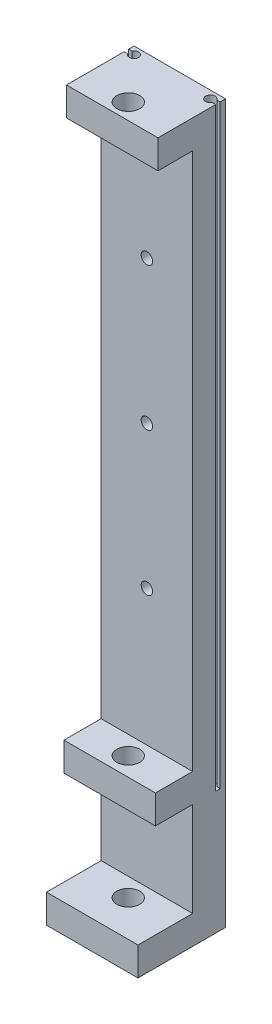
ISO-10303-21;
HEADER;
FILE_DESCRIPTION(('STEP AP214'),'2;1');
FILE_NAME('part.step','',(''),(''),'','','');
FILE_SCHEMA(('AUTOMOTIVE_DESIGN { 1 0 10303 214 1 1 1 1 }'));
ENDSEC;
DATA;
#1=APPLICATION_CONTEXT('core data for automotive mechanical design processes');
#2=APPLICATION_PROTOCOL_DEFINITION('international standard','automotive_design',2000,#1);
#3=PRODUCT_CONTEXT('',#1,'mechanical');
#4=PRODUCT('Part','Part','',(#3));
#5=PRODUCT_RELATED_PRODUCT_CATEGORY('part','',(#4));
#6=PRODUCT_DEFINITION_FORMATION('','',#4);
#7=PRODUCT_DEFINITION_CONTEXT('part definition',#1,'design');
#8=PRODUCT_DEFINITION('design','',#6,#7);
#9=PRODUCT_DEFINITION_SHAPE('','',#8);
#10=(LENGTH_UNIT() NAMED_UNIT(*) SI_UNIT(.MILLI.,.METRE.));
#11=(NAMED_UNIT(*) PLANE_ANGLE_UNIT() SI_UNIT($,.RADIAN.));
#12=(NAMED_UNIT(*) SI_UNIT($,.STERADIAN.) SOLID_ANGLE_UNIT());
#13=UNCERTAINTY_MEASURE_WITH_UNIT(LENGTH_MEASURE(1.E-05),#10,'distance_accuracy_value','');
#14=(GEOMETRIC_REPRESENTATION_CONTEXT(3) GLOBAL_UNCERTAINTY_ASSIGNED_CONTEXT((#13)) GLOBAL_UNIT_ASSIGNED_CONTEXT((#10,
#11,#12)) REPRESENTATION_CONTEXT('',''));
#15=CARTESIAN_POINT('',(0.,0.,0.));
#16=DIRECTION('',(0.,0.,1.));
#17=DIRECTION('',(1.,0.,0.));
#18=AXIS2_PLACEMENT_3D('',#15,#16,#17);
#19=CARTESIAN_POINT('',(-16.,275.003676271839,-3.8));
#20=DIRECTION('',(0.,0.,-1.));
#21=DIRECTION('',(-1.,0.,0.));
#22=AXIS2_PLACEMENT_3D('',#19,#20,#21);
#23=PLANE('',#22);
#24=CARTESIAN_POINT('',(1.74574066942157E-13,100.5,-3.8));
#25=DIRECTION('',(0.,0.,-1.));
#26=DIRECTION('',(-1.,0.,0.));
#27=AXIS2_PLACEMENT_3D('',#24,#25,#26);
#28=CIRCLE('',#27,2.);
#29=CARTESIAN_POINT('',(-1.99999999999983,100.5,-3.8));
#30=VERTEX_POINT('',#29);
#31=EDGE_CURVE('E250',#30,#30,#28,.F.);
#32=ORIENTED_EDGE('',*,*,#31,.F.);
#33=EDGE_LOOP('',(#32));
#34=FACE_BOUND('',#33,.T.);
#35=CARTESIAN_POINT('',(3.49148133884313E-13,150.5,-3.8));
#36=DIRECTION('',(0.,0.,-1.));
#37=DIRECTION('',(-1.,0.,0.));
#38=AXIS2_PLACEMENT_3D('',#35,#36,#37);
#39=CIRCLE('',#38,2.);
#40=CARTESIAN_POINT('',(-1.99999999999965,150.5,-3.8));
#41=VERTEX_POINT('',#40);
#42=EDGE_CURVE('E257',#41,#41,#39,.F.);
#43=ORIENTED_EDGE('',*,*,#42,.F.);
#44=EDGE_LOOP('',(#43));
#45=FACE_BOUND('',#44,.T.);
#46=CARTESIAN_POINT('',(5.2372220082647E-13,200.5,-3.8));
#47=DIRECTION('',(0.,0.,-1.));
#48=DIRECTION('',(-1.,0.,0.));
#49=AXIS2_PLACEMENT_3D('',#46,#47,#48);
#50=CIRCLE('',#49,2.);
#51=CARTESIAN_POINT('',(-1.99999999999948,200.5,-3.8));
#52=VERTEX_POINT('',#51);
#53=EDGE_CURVE('E263',#52,#52,#50,.F.);
#54=ORIENTED_EDGE('',*,*,#53,.F.);
#55=EDGE_LOOP('',(#54));
#56=FACE_BOUND('',#55,.T.);
#57=DIRECTION('',(1.,0.,0.));
#58=VECTOR('',#57,1.);
#59=CARTESIAN_POINT('',(-16.,53.,-3.8));
#60=LINE('',#59,#58);
#61=CARTESIAN_POINT('',(-16.,53.,-3.8));
#62=VERTEX_POINT('',#61);
#63=CARTESIAN_POINT('',(16.,53.,-3.8));
#64=VERTEX_POINT('',#63);
#65=EDGE_CURVE('E299',#62,#64,#60,.T.);
#66=ORIENTED_EDGE('',*,*,#65,.T.);
#67=DIRECTION('',(0.,-1.,0.));
#68=VECTOR('',#67,1.);
#69=CARTESIAN_POINT('',(16.,275.003676271839,-3.8));
#70=LINE('',#69,#68);
#71=CARTESIAN_POINT('',(16.,241.,-3.8));
#72=VERTEX_POINT('',#71);
#73=EDGE_CURVE('E344',#72,#64,#70,.T.);
#74=ORIENTED_EDGE('',*,*,#73,.F.);
#75=DIRECTION('',(1.,0.,0.));
#76=VECTOR('',#75,1.);
#77=CARTESIAN_POINT('',(-16.,241.,-3.8));
#78=LINE('',#77,#76);
#79=CARTESIAN_POINT('',(-16.,241.,-3.8));
#80=VERTEX_POINT('',#79);
#81=EDGE_CURVE('E340',#80,#72,#78,.T.);
#82=ORIENTED_EDGE('',*,*,#81,.F.);
#83=DIRECTION('',(0.,-1.,0.));
#84=VECTOR('',#83,1.);
#85=CARTESIAN_POINT('',(-16.,275.003676271839,-3.8));
#86=LINE('',#85,#84);
#87=EDGE_CURVE('E339',#80,#62,#86,.T.);
#88=ORIENTED_EDGE('',*,*,#87,.T.);
#89=EDGE_LOOP('',(#66,#74,#82,#88));
#90=FACE_BOUND('',#89,.T.);
#91=ADVANCED_FACE('F45',(#34,#45,#56,#90),#23,.F.);
#92=CARTESIAN_POINT('',(0.,10.,0.));
#93=DIRECTION('',(0.,-1.,0.));
#94=DIRECTION('',(0.,0.,-1.));
#95=AXIS2_PLACEMENT_3D('',#92,#93,#94);
#96=PLANE('',#95);
#97=CARTESIAN_POINT('',(0.,10.,2.7));
#98=DIRECTION('',(0.,-1.,0.));
#99=DIRECTION('',(0.,0.,-1.));
#100=AXIS2_PLACEMENT_3D('',#97,#98,#99);
#101=CIRCLE('',#100,4.);
#102=CARTESIAN_POINT('',(0.,10.,-1.3));
#103=VERTEX_POINT('',#102);
#104=EDGE_CURVE('E281',#103,#103,#101,.T.);
#105=ORIENTED_EDGE('',*,*,#104,.T.);
#106=EDGE_LOOP('',(#105));
#107=FACE_BOUND('',#106,.T.);
#108=DIRECTION('',(1.,0.,0.));
#109=VECTOR('',#108,1.);
#110=CARTESIAN_POINT('',(-16.,10.,-3.8));
#111=LINE('',#110,#109);
#112=CARTESIAN_POINT('',(-16.,10.,-3.8));
#113=VERTEX_POINT('',#112);
#114=CARTESIAN_POINT('',(16.,10.,-3.8));
#115=VERTEX_POINT('',#114);
#116=EDGE_CURVE('E335',#113,#115,#111,.T.);
#117=ORIENTED_EDGE('',*,*,#116,.F.);
#118=DIRECTION('',(0.,0.,1.));
#119=VECTOR('',#118,1.);
#120=CARTESIAN_POINT('',(-16.,10.,15.3));
#121=LINE('',#120,#119);
#122=CARTESIAN_POINT('',(-16.,10.,15.3));
#123=VERTEX_POINT('',#122);
#124=EDGE_CURVE('E351',#113,#123,#121,.T.);
#125=ORIENTED_EDGE('',*,*,#124,.T.);
#126=DIRECTION('',(1.,0.,0.));
#127=VECTOR('',#126,1.);
#128=CARTESIAN_POINT('',(-16.,10.,15.3));
#129=LINE('',#128,#127);
#130=CARTESIAN_POINT('',(16.,10.,15.3));
#131=VERTEX_POINT('',#130);
#132=EDGE_CURVE('E354',#123,#131,#129,.T.);
#133=ORIENTED_EDGE('',*,*,#132,.T.);
#134=DIRECTION('',(0.,0.,-1.));
#135=VECTOR('',#134,1.);
#136=CARTESIAN_POINT('',(16.,10.,15.3));
#137=LINE('',#136,#135);
#138=EDGE_CURVE('E348',#131,#115,#137,.T.);
#139=ORIENTED_EDGE('',*,*,#138,.T.);
#140=EDGE_LOOP('',(#117,#125,#133,#139));
#141=FACE_BOUND('',#140,.T.);
#142=ADVANCED_FACE('F389',(#107,#141),#96,.F.);
#143=CARTESIAN_POINT('',(16.,10.,15.3));
#144=DIRECTION('',(-1.,0.,0.));
#145=DIRECTION('',(0.,0.,1.));
#146=AXIS2_PLACEMENT_3D('',#143,#144,#145);
#147=PLANE('',#146);
#148=DIRECTION('',(0.,0.,-1.));
#149=VECTOR('',#148,1.);
#150=CARTESIAN_POINT('',(16.,43.,-11.85));
#151=LINE('',#150,#149);
#152=CARTESIAN_POINT('',(16.,43.,-11.85));
#153=VERTEX_POINT('',#152);
#154=CARTESIAN_POINT('',(16.,43.,-13.45));
#155=VERTEX_POINT('',#154);
#156=EDGE_CURVE('E237',#153,#155,#151,.T.);
#157=ORIENTED_EDGE('',*,*,#156,.F.);
#158=DIRECTION('',(0.,1.,0.));
#159=VECTOR('',#158,1.);
#160=CARTESIAN_POINT('',(16.,37.5796679068529,-11.85));
#161=LINE('',#160,#159);
#162=CARTESIAN_POINT('',(16.,251.,-11.85));
#163=VERTEX_POINT('',#162);
#164=EDGE_CURVE('E227',#153,#163,#161,.T.);
#165=ORIENTED_EDGE('',*,*,#164,.T.);
#166=DIRECTION('',(0.,0.,1.));
#167=VECTOR('',#166,1.);
#168=CARTESIAN_POINT('',(16.,251.,-15.3));
#169=LINE('',#168,#167);
#170=CARTESIAN_POINT('',(16.,251.,8.30000000000001));
#171=VERTEX_POINT('',#170);
#172=EDGE_CURVE('E324',#163,#171,#169,.T.);
#173=ORIENTED_EDGE('',*,*,#172,.T.);
#174=DIRECTION('',(0.,1.,0.));
#175=VECTOR('',#174,1.);
#176=CARTESIAN_POINT('',(16.,241.,8.30000000000001));
#177=LINE('',#176,#175);
#178=CARTESIAN_POINT('',(16.,241.,8.30000000000001));
#179=VERTEX_POINT('',#178);
#180=EDGE_CURVE('E331',#179,#171,#177,.T.);
#181=ORIENTED_EDGE('',*,*,#180,.F.);
#182=DIRECTION('',(0.,0.,1.));
#183=VECTOR('',#182,1.);
#184=CARTESIAN_POINT('',(16.,241.,-15.3));
#185=LINE('',#184,#183);
#186=EDGE_CURVE('E313',#72,#179,#185,.T.);
#187=ORIENTED_EDGE('',*,*,#186,.F.);
#188=ORIENTED_EDGE('',*,*,#73,.T.);
#189=DIRECTION('',(0.,0.,1.));
#190=VECTOR('',#189,1.);
#191=CARTESIAN_POINT('',(16.,53.,9.2));
#192=LINE('',#191,#190);
#193=CARTESIAN_POINT('',(16.,53.,9.2));
#194=VERTEX_POINT('',#193);
#195=EDGE_CURVE('E301',#64,#194,#192,.T.);
#196=ORIENTED_EDGE('',*,*,#195,.T.);
#197=DIRECTION('',(0.,1.,0.));
#198=VECTOR('',#197,1.);
#199=CARTESIAN_POINT('',(16.,43.,9.2));
#200=LINE('',#199,#198);
#201=CARTESIAN_POINT('',(16.,43.,9.2));
#202=VERTEX_POINT('',#201);
#203=EDGE_CURVE('E306',#202,#194,#200,.T.);
#204=ORIENTED_EDGE('',*,*,#203,.F.);
#205=DIRECTION('',(0.,0.,1.));
#206=VECTOR('',#205,1.);
#207=CARTESIAN_POINT('',(16.,43.,9.2));
#208=LINE('',#207,#206);
#209=CARTESIAN_POINT('',(16.,43.,-3.8));
#210=VERTEX_POINT('',#209);
#211=EDGE_CURVE('E292',#210,#202,#208,.T.);
#212=ORIENTED_EDGE('',*,*,#211,.F.);
#213=EDGE_CURVE('E338',#210,#115,#70,.T.);
#214=ORIENTED_EDGE('',*,*,#213,.T.);
#215=ORIENTED_EDGE('',*,*,#138,.F.);
#216=DIRECTION('',(0.,-1.,0.));
#217=VECTOR('',#216,1.);
#218=CARTESIAN_POINT('',(16.,10.,15.3));
#219=LINE('',#218,#217);
#220=CARTESIAN_POINT('',(16.,0.,15.3));
#221=VERTEX_POINT('',#220);
#222=EDGE_CURVE('E356',#131,#221,#219,.T.);
#223=ORIENTED_EDGE('',*,*,#222,.T.);
#224=DIRECTION('',(0.,0.,-1.));
#225=VECTOR('',#224,1.);
#226=CARTESIAN_POINT('',(16.,0.,15.3));
#227=LINE('',#226,#225);
#228=CARTESIAN_POINT('',(16.,0.,-15.3));
#229=VERTEX_POINT('',#228);
#230=EDGE_CURVE('E343',#221,#229,#227,.T.);
#231=ORIENTED_EDGE('',*,*,#230,.T.);
#232=DIRECTION('',(0.,-1.,0.));
#233=VECTOR('',#232,1.);
#234=CARTESIAN_POINT('',(16.,10.,-15.3));
#235=LINE('',#234,#233);
#236=CARTESIAN_POINT('',(16.,251.,-15.3));
#237=VERTEX_POINT('',#236);
#238=EDGE_CURVE('E11',#237,#229,#235,.T.);
#239=ORIENTED_EDGE('',*,*,#238,.F.);
#240=CARTESIAN_POINT('',(16.,251.,-13.45));
#241=VERTEX_POINT('',#240);
#242=EDGE_CURVE('E325',#237,#241,#169,.T.);
#243=ORIENTED_EDGE('',*,*,#242,.T.);
#244=DIRECTION('',(0.,1.,0.));
#245=VECTOR('',#244,1.);
#246=CARTESIAN_POINT('',(16.,37.5796679068529,-13.45));
#247=LINE('',#246,#245);
#248=EDGE_CURVE('E236',#155,#241,#247,.T.);
#249=ORIENTED_EDGE('',*,*,#248,.F.);
#250=EDGE_LOOP('',(#157,#165,#173,#181,#187,#188,#196,#204,#212,#214,#215,#223,#231,#239,#243,#249));
#251=FACE_BOUND('',#250,.T.);
#252=ADVANCED_FACE('F47',(#251),#147,.F.);
#253=CARTESIAN_POINT('',(-16.,10.,-15.3));
#254=DIRECTION('',(0.,0.,1.));
#255=DIRECTION('',(1.,0.,0.));
#256=AXIS2_PLACEMENT_3D('',#253,#254,#255);
#257=PLANE('',#256);
#258=CARTESIAN_POINT('',(0.,50.5,-15.3));
#259=DIRECTION('',(0.,0.,-1.));
#260=DIRECTION('',(-1.,0.,0.));
#261=AXIS2_PLACEMENT_3D('',#258,#259,#260);
#262=CIRCLE('',#261,2.);
#263=CARTESIAN_POINT('',(-2.,50.5,-15.3));
#264=VERTEX_POINT('',#263);
#265=EDGE_CURVE('E246',#264,#264,#262,.T.);
#266=ORIENTED_EDGE('',*,*,#265,.F.);
#267=EDGE_LOOP('',(#266));
#268=FACE_BOUND('',#267,.T.);
#269=CARTESIAN_POINT('',(1.74574066942157E-13,100.5,-15.3));
#270=DIRECTION('',(0.,0.,-1.));
#271=DIRECTION('',(-1.,0.,0.));
#272=AXIS2_PLACEMENT_3D('',#269,#270,#271);
#273=CIRCLE('',#272,2.);
#274=CARTESIAN_POINT('',(-1.99999999999983,100.5,-15.3));
#275=VERTEX_POINT('',#274);
#276=EDGE_CURVE('E254',#275,#275,#273,.T.);
#277=ORIENTED_EDGE('',*,*,#276,.F.);
#278=EDGE_LOOP('',(#277));
#279=FACE_BOUND('',#278,.T.);
#280=CARTESIAN_POINT('',(3.49148133884313E-13,150.5,-15.3));
#281=DIRECTION('',(0.,0.,-1.));
#282=DIRECTION('',(-1.,0.,0.));
#283=AXIS2_PLACEMENT_3D('',#280,#281,#282);
#284=CIRCLE('',#283,2.);
#285=CARTESIAN_POINT('',(-1.99999999999965,150.5,-15.3));
#286=VERTEX_POINT('',#285);
#287=EDGE_CURVE('E260',#286,#286,#284,.T.);
#288=ORIENTED_EDGE('',*,*,#287,.F.);
#289=EDGE_LOOP('',(#288));
#290=FACE_BOUND('',#289,.T.);
#291=CARTESIAN_POINT('',(5.2372220082647E-13,200.5,-15.3));
#292=DIRECTION('',(0.,0.,-1.));
#293=DIRECTION('',(-1.,0.,0.));
#294=AXIS2_PLACEMENT_3D('',#291,#292,#293);
#295=CIRCLE('',#294,2.);
#296=CARTESIAN_POINT('',(-1.99999999999948,200.5,-15.3));
#297=VERTEX_POINT('',#296);
#298=EDGE_CURVE('E217',#297,#297,#295,.T.);
#299=ORIENTED_EDGE('',*,*,#298,.F.);
#300=EDGE_LOOP('',(#299));
#301=FACE_BOUND('',#300,.T.);
#302=DIRECTION('',(-1.,0.,0.));
#303=VECTOR('',#302,1.);
#304=CARTESIAN_POINT('',(-16.,0.,-15.3));
#305=LINE('',#304,#303);
#306=CARTESIAN_POINT('',(-16.,0.,-15.3));
#307=VERTEX_POINT('',#306);
#308=EDGE_CURVE('E359',#229,#307,#305,.T.);
#309=ORIENTED_EDGE('',*,*,#308,.T.);
#310=DIRECTION('',(0.,-1.,0.));
#311=VECTOR('',#310,1.);
#312=CARTESIAN_POINT('',(-16.,10.,-15.3));
#313=LINE('',#312,#311);
#314=CARTESIAN_POINT('',(-16.,251.,-15.3));
#315=VERTEX_POINT('',#314);
#316=EDGE_CURVE('E54',#315,#307,#313,.T.);
#317=ORIENTED_EDGE('',*,*,#316,.F.);
#318=DIRECTION('',(1.,0.,0.));
#319=VECTOR('',#318,1.);
#320=CARTESIAN_POINT('',(-16.,251.,-15.3));
#321=LINE('',#320,#319);
#322=EDGE_CURVE('E321',#315,#237,#321,.T.);
#323=ORIENTED_EDGE('',*,*,#322,.T.);
#324=ORIENTED_EDGE('',*,*,#238,.T.);
#325=EDGE_LOOP('',(#309,#317,#323,#324));
#326=FACE_BOUND('',#325,.T.);
#327=ADVANCED_FACE('F432',(#268,#279,#290,#301,#326),#257,.F.);
#328=CARTESIAN_POINT('',(-16.,10.,15.3));
#329=DIRECTION('',(1.,0.,0.));
#330=DIRECTION('',(0.,0.,-1.));
#331=AXIS2_PLACEMENT_3D('',#328,#329,#330);
#332=PLANE('',#331);
#333=DIRECTION('',(0.,0.,1.));
#334=VECTOR('',#333,1.);
#335=CARTESIAN_POINT('',(-16.,43.,-11.85));
#336=LINE('',#335,#334);
#337=CARTESIAN_POINT('',(-16.,43.,-13.45));
#338=VERTEX_POINT('',#337);
#339=CARTESIAN_POINT('',(-16.,43.,-11.85));
#340=VERTEX_POINT('',#339);
#341=EDGE_CURVE('E194',#338,#340,#336,.T.);
#342=ORIENTED_EDGE('',*,*,#341,.F.);
#343=DIRECTION('',(0.,1.,0.));
#344=VECTOR('',#343,1.);
#345=CARTESIAN_POINT('',(-16.,37.5796679068529,-13.45));
#346=LINE('',#345,#344);
#347=CARTESIAN_POINT('',(-16.,251.,-13.45));
#348=VERTEX_POINT('',#347);
#349=EDGE_CURVE('E184',#338,#348,#346,.T.);
#350=ORIENTED_EDGE('',*,*,#349,.T.);
#351=DIRECTION('',(0.,0.,-1.));
#352=VECTOR('',#351,1.);
#353=CARTESIAN_POINT('',(-16.,251.,-15.3));
#354=LINE('',#353,#352);
#355=EDGE_CURVE('E309',#348,#315,#354,.T.);
#356=ORIENTED_EDGE('',*,*,#355,.T.);
#357=ORIENTED_EDGE('',*,*,#316,.T.);
#358=DIRECTION('',(0.,0.,1.));
#359=VECTOR('',#358,1.);
#360=CARTESIAN_POINT('',(-16.,0.,15.3));
#361=LINE('',#360,#359);
#362=CARTESIAN_POINT('',(-16.,0.,15.3));
#363=VERTEX_POINT('',#362);
#364=EDGE_CURVE('E361',#307,#363,#361,.T.);
#365=ORIENTED_EDGE('',*,*,#364,.T.);
#366=DIRECTION('',(0.,-1.,0.));
#367=VECTOR('',#366,1.);
#368=CARTESIAN_POINT('',(-16.,10.,15.3));
#369=LINE('',#368,#367);
#370=EDGE_CURVE('E366',#123,#363,#369,.T.);
#371=ORIENTED_EDGE('',*,*,#370,.F.);
#372=ORIENTED_EDGE('',*,*,#124,.F.);
#373=CARTESIAN_POINT('',(-16.,43.,-3.8));
#374=VERTEX_POINT('',#373);
#375=EDGE_CURVE('E334',#374,#113,#86,.T.);
#376=ORIENTED_EDGE('',*,*,#375,.F.);
#377=DIRECTION('',(0.,0.,-1.));
#378=VECTOR('',#377,1.);
#379=CARTESIAN_POINT('',(-16.,43.,9.2));
#380=LINE('',#379,#378);
#381=CARTESIAN_POINT('',(-16.,43.,9.2));
#382=VERTEX_POINT('',#381);
#383=EDGE_CURVE('E285',#382,#374,#380,.T.);
#384=ORIENTED_EDGE('',*,*,#383,.F.);
#385=DIRECTION('',(0.,1.,0.));
#386=VECTOR('',#385,1.);
#387=CARTESIAN_POINT('',(-16.,43.,9.2));
#388=LINE('',#387,#386);
#389=CARTESIAN_POINT('',(-16.,53.,9.2));
#390=VERTEX_POINT('',#389);
#391=EDGE_CURVE('E296',#382,#390,#388,.T.);
#392=ORIENTED_EDGE('',*,*,#391,.T.);
#393=DIRECTION('',(0.,0.,-1.));
#394=VECTOR('',#393,1.);
#395=CARTESIAN_POINT('',(-16.,53.,9.2));
#396=LINE('',#395,#394);
#397=EDGE_CURVE('E284',#390,#62,#396,.T.);
#398=ORIENTED_EDGE('',*,*,#397,.T.);
#399=ORIENTED_EDGE('',*,*,#87,.F.);
#400=DIRECTION('',(0.,0.,-1.));
#401=VECTOR('',#400,1.);
#402=CARTESIAN_POINT('',(-16.,241.,-15.3));
#403=LINE('',#402,#401);
#404=CARTESIAN_POINT('',(-16.,241.,8.3));
#405=VERTEX_POINT('',#404);
#406=EDGE_CURVE('E310',#405,#80,#403,.T.);
#407=ORIENTED_EDGE('',*,*,#406,.F.);
#408=DIRECTION('',(0.,1.,0.));
#409=VECTOR('',#408,1.);
#410=CARTESIAN_POINT('',(-16.,241.,8.3));
#411=LINE('',#410,#409);
#412=CARTESIAN_POINT('',(-16.,251.,8.3));
#413=VERTEX_POINT('',#412);
#414=EDGE_CURVE('E318',#405,#413,#411,.T.);
#415=ORIENTED_EDGE('',*,*,#414,.T.);
#416=CARTESIAN_POINT('',(-16.,251.,-11.85));
#417=VERTEX_POINT('',#416);
#418=EDGE_CURVE('E319',#413,#417,#354,.T.);
#419=ORIENTED_EDGE('',*,*,#418,.T.);
#420=DIRECTION('',(0.,1.,0.));
#421=VECTOR('',#420,1.);
#422=CARTESIAN_POINT('',(-16.,37.5796679068529,-11.85));
#423=LINE('',#422,#421);
#424=EDGE_CURVE('E206',#340,#417,#423,.T.);
#425=ORIENTED_EDGE('',*,*,#424,.F.);
#426=EDGE_LOOP('',(#342,#350,#356,#357,#365,#371,#372,#376,#384,#392,#398,#399,#407,#415,#419,#425));
#427=FACE_BOUND('',#426,.T.);
#428=ADVANCED_FACE('F204',(#427),#332,.F.);
#429=CARTESIAN_POINT('',(-16.,10.,15.3));
#430=DIRECTION('',(0.,0.,-1.));
#431=DIRECTION('',(-1.,0.,0.));
#432=AXIS2_PLACEMENT_3D('',#429,#430,#431);
#433=PLANE('',#432);
#434=DIRECTION('',(1.,0.,0.));
#435=VECTOR('',#434,1.);
#436=CARTESIAN_POINT('',(-16.,0.,15.3));
#437=LINE('',#436,#435);
#438=EDGE_CURVE('E352',#363,#221,#437,.T.);
#439=ORIENTED_EDGE('',*,*,#438,.T.);
#440=ORIENTED_EDGE('',*,*,#222,.F.);
#441=ORIENTED_EDGE('',*,*,#132,.F.);
#442=ORIENTED_EDGE('',*,*,#370,.T.);
#443=EDGE_LOOP('',(#439,#440,#441,#442));
#444=FACE_BOUND('',#443,.T.);
#445=ADVANCED_FACE('F381',(#444),#433,.F.);
#446=CARTESIAN_POINT('',(0.,0.,0.));
#447=DIRECTION('',(0.,-1.,0.));
#448=DIRECTION('',(0.,0.,-1.));
#449=AXIS2_PLACEMENT_3D('',#446,#447,#448);
#450=PLANE('',#449);
#451=CARTESIAN_POINT('',(0.,0.,2.7));
#452=DIRECTION('',(0.,-1.,0.));
#453=DIRECTION('',(0.,0.,-1.));
#454=AXIS2_PLACEMENT_3D('',#451,#452,#453);
#455=CIRCLE('',#454,4.);
#456=CARTESIAN_POINT('',(0.,0.,-1.3));
#457=VERTEX_POINT('',#456);
#458=EDGE_CURVE('E253',#457,#457,#455,.T.);
#459=ORIENTED_EDGE('',*,*,#458,.F.);
#460=EDGE_LOOP('',(#459));
#461=FACE_BOUND('',#460,.T.);
#462=ORIENTED_EDGE('',*,*,#230,.F.);
#463=ORIENTED_EDGE('',*,*,#438,.F.);
#464=ORIENTED_EDGE('',*,*,#364,.F.);
#465=ORIENTED_EDGE('',*,*,#308,.F.);
#466=EDGE_LOOP('',(#462,#463,#464,#465));
#467=FACE_BOUND('',#466,.T.);
#468=ADVANCED_FACE('F378',(#461,#467),#450,.T.);
#469=ORIENTED_EDGE('',*,*,#213,.F.);
#470=DIRECTION('',(1.,0.,0.));
#471=VECTOR('',#470,1.);
#472=CARTESIAN_POINT('',(-16.,43.,-3.8));
#473=LINE('',#472,#471);
#474=EDGE_CURVE('E288',#374,#210,#473,.T.);
#475=ORIENTED_EDGE('',*,*,#474,.F.);
#476=ORIENTED_EDGE('',*,*,#375,.T.);
#477=ORIENTED_EDGE('',*,*,#116,.T.);
#478=EDGE_LOOP('',(#469,#475,#476,#477));
#479=FACE_BOUND('',#478,.T.);
#480=ADVANCED_FACE('F392',(#479),#23,.F.);
#481=CARTESIAN_POINT('',(0.,241.,0.));
#482=DIRECTION('',(0.,1.,0.));
#483=DIRECTION('',(0.,0.,1.));
#484=AXIS2_PLACEMENT_3D('',#481,#482,#483);
#485=PLANE('',#484);
#486=CARTESIAN_POINT('',(0.,241.,2.7));
#487=DIRECTION('',(0.,1.,0.));
#488=DIRECTION('',(0.,0.,1.));
#489=AXIS2_PLACEMENT_3D('',#486,#487,#488);
#490=CIRCLE('',#489,4.);
#491=CARTESIAN_POINT('',(0.,241.,6.7));
#492=VERTEX_POINT('',#491);
#493=EDGE_CURVE('E278',#492,#492,#490,.T.);
#494=ORIENTED_EDGE('',*,*,#493,.T.);
#495=EDGE_LOOP('',(#494));
#496=FACE_BOUND('',#495,.T.);
#497=ORIENTED_EDGE('',*,*,#406,.T.);
#498=ORIENTED_EDGE('',*,*,#81,.T.);
#499=ORIENTED_EDGE('',*,*,#186,.T.);
#500=DIRECTION('',(-1.,0.,0.));
#501=VECTOR('',#500,1.);
#502=CARTESIAN_POINT('',(-16.,241.,8.3));
#503=LINE('',#502,#501);
#504=EDGE_CURVE('E316',#179,#405,#503,.T.);
#505=ORIENTED_EDGE('',*,*,#504,.T.);
#506=EDGE_LOOP('',(#497,#498,#499,#505));
#507=FACE_BOUND('',#506,.T.);
#508=ADVANCED_FACE('F414',(#496,#507),#485,.F.);
#509=CARTESIAN_POINT('',(-16.,241.,8.3));
#510=DIRECTION('',(0.,0.,-1.));
#511=DIRECTION('',(-1.,0.,0.));
#512=AXIS2_PLACEMENT_3D('',#509,#510,#511);
#513=PLANE('',#512);
#514=DIRECTION('',(-1.,0.,0.));
#515=VECTOR('',#514,1.);
#516=CARTESIAN_POINT('',(-16.,251.,8.3));
#517=LINE('',#516,#515);
#518=EDGE_CURVE('E314',#171,#413,#517,.T.);
#519=ORIENTED_EDGE('',*,*,#518,.T.);
#520=ORIENTED_EDGE('',*,*,#414,.F.);
#521=ORIENTED_EDGE('',*,*,#504,.F.);
#522=ORIENTED_EDGE('',*,*,#180,.T.);
#523=EDGE_LOOP('',(#519,#520,#521,#522));
#524=FACE_BOUND('',#523,.T.);
#525=ADVANCED_FACE('F444',(#524),#513,.F.);
#526=CARTESIAN_POINT('',(0.,251.,0.));
#527=DIRECTION('',(0.,1.,0.));
#528=DIRECTION('',(0.,0.,1.));
#529=AXIS2_PLACEMENT_3D('',#526,#527,#528);
#530=PLANE('',#529);
#531=DIRECTION('',(-1.,0.,0.));
#532=VECTOR('',#531,1.);
#533=CARTESIAN_POINT('',(-14.7930869689662,251.,-13.45));
#534=LINE('',#533,#532);
#535=CARTESIAN_POINT('',(-14.7930869689662,251.,-13.45));
#536=VERTEX_POINT('',#535);
#537=EDGE_CURVE('E190',#536,#348,#534,.T.);
#538=ORIENTED_EDGE('',*,*,#537,.F.);
#539=CARTESIAN_POINT('',(-13.35,251.,-12.65));
#540=DIRECTION('',(0.,1.,0.));
#541=DIRECTION('',(0.,0.,1.));
#542=AXIS2_PLACEMENT_3D('',#539,#540,#541);
#543=CIRCLE('',#542,1.65);
#544=CARTESIAN_POINT('',(-14.7930869689662,251.,-11.85));
#545=VERTEX_POINT('',#544);
#546=EDGE_CURVE('E245',#545,#536,#543,.T.);
#547=ORIENTED_EDGE('',*,*,#546,.F.);
#548=DIRECTION('',(1.,0.,0.));
#549=VECTOR('',#548,1.);
#550=CARTESIAN_POINT('',(-14.7930869689662,251.,-11.85));
#551=LINE('',#550,#549);
#552=EDGE_CURVE('E61',#417,#545,#551,.T.);
#553=ORIENTED_EDGE('',*,*,#552,.F.);
#554=ORIENTED_EDGE('',*,*,#418,.F.);
#555=ORIENTED_EDGE('',*,*,#518,.F.);
#556=ORIENTED_EDGE('',*,*,#172,.F.);
#557=DIRECTION('',(1.,0.,0.));
#558=VECTOR('',#557,1.);
#559=CARTESIAN_POINT('',(14.7930869689662,251.,-11.85));
#560=LINE('',#559,#558);
#561=CARTESIAN_POINT('',(14.7930869689662,251.,-11.85));
#562=VERTEX_POINT('',#561);
#563=EDGE_CURVE('E220',#562,#163,#560,.T.);
#564=ORIENTED_EDGE('',*,*,#563,.F.);
#565=CARTESIAN_POINT('',(13.35,251.,-12.65));
#566=DIRECTION('',(0.,1.,0.));
#567=DIRECTION('',(0.,0.,-1.));
#568=AXIS2_PLACEMENT_3D('',#565,#566,#567);
#569=CIRCLE('',#568,1.65);
#570=CARTESIAN_POINT('',(14.7930869689662,251.,-13.45));
#571=VERTEX_POINT('',#570);
#572=EDGE_CURVE('E222',#571,#562,#569,.T.);
#573=ORIENTED_EDGE('',*,*,#572,.F.);
#574=DIRECTION('',(-1.,0.,0.));
#575=VECTOR('',#574,1.);
#576=CARTESIAN_POINT('',(14.7930869689662,251.,-13.45));
#577=LINE('',#576,#575);
#578=EDGE_CURVE('E69',#241,#571,#577,.T.);
#579=ORIENTED_EDGE('',*,*,#578,.F.);
#580=ORIENTED_EDGE('',*,*,#242,.F.);
#581=ORIENTED_EDGE('',*,*,#322,.F.);
#582=ORIENTED_EDGE('',*,*,#355,.F.);
#583=EDGE_LOOP('',(#538,#547,#553,#554,#555,#556,#564,#573,#579,#580,#581,#582));
#584=FACE_BOUND('',#583,.T.);
#585=CARTESIAN_POINT('',(0.,251.,2.7));
#586=DIRECTION('',(0.,-1.,0.));
#587=DIRECTION('',(0.,0.,-1.));
#588=AXIS2_PLACEMENT_3D('',#585,#586,#587);
#589=CIRCLE('',#588,4.);
#590=CARTESIAN_POINT('',(0.,251.,-1.3));
#591=VERTEX_POINT('',#590);
#592=EDGE_CURVE('E272',#591,#591,#589,.T.);
#593=ORIENTED_EDGE('',*,*,#592,.T.);
#594=EDGE_LOOP('',(#593));
#595=FACE_BOUND('',#594,.T.);
#596=ADVANCED_FACE('F421',(#584,#595),#530,.T.);
#597=CARTESIAN_POINT('',(-16.,43.,9.2));
#598=DIRECTION('',(0.,0.,-1.));
#599=DIRECTION('',(-1.,0.,0.));
#600=AXIS2_PLACEMENT_3D('',#597,#598,#599);
#601=PLANE('',#600);
#602=DIRECTION('',(-1.,0.,0.));
#603=VECTOR('',#602,1.);
#604=CARTESIAN_POINT('',(-16.,53.,9.2));
#605=LINE('',#604,#603);
#606=EDGE_CURVE('E289',#194,#390,#605,.T.);
#607=ORIENTED_EDGE('',*,*,#606,.T.);
#608=ORIENTED_EDGE('',*,*,#391,.F.);
#609=DIRECTION('',(-1.,0.,0.));
#610=VECTOR('',#609,1.);
#611=CARTESIAN_POINT('',(-16.,43.,9.2));
#612=LINE('',#611,#610);
#613=EDGE_CURVE('E294',#202,#382,#612,.T.);
#614=ORIENTED_EDGE('',*,*,#613,.F.);
#615=ORIENTED_EDGE('',*,*,#203,.T.);
#616=EDGE_LOOP('',(#607,#608,#614,#615));
#617=FACE_BOUND('',#616,.T.);
#618=ADVANCED_FACE('F401',(#617),#601,.F.);
#619=CARTESIAN_POINT('',(0.,43.,0.));
#620=DIRECTION('',(0.,-1.,0.));
#621=DIRECTION('',(0.,0.,-1.));
#622=AXIS2_PLACEMENT_3D('',#619,#620,#621);
#623=PLANE('',#622);
#624=CARTESIAN_POINT('',(0.,43.,2.7));
#625=DIRECTION('',(0.,-1.,0.));
#626=DIRECTION('',(0.,0.,-1.));
#627=AXIS2_PLACEMENT_3D('',#624,#625,#626);
#628=CIRCLE('',#627,4.);
#629=CARTESIAN_POINT('',(0.,43.,-1.3));
#630=VERTEX_POINT('',#629);
#631=EDGE_CURVE('E275',#630,#630,#628,.T.);
#632=ORIENTED_EDGE('',*,*,#631,.F.);
#633=EDGE_LOOP('',(#632));
#634=FACE_BOUND('',#633,.T.);
#635=ORIENTED_EDGE('',*,*,#383,.T.);
#636=ORIENTED_EDGE('',*,*,#474,.T.);
#637=ORIENTED_EDGE('',*,*,#211,.T.);
#638=ORIENTED_EDGE('',*,*,#613,.T.);
#639=EDGE_LOOP('',(#635,#636,#637,#638));
#640=FACE_BOUND('',#639,.T.);
#641=ADVANCED_FACE('F396',(#634,#640),#623,.T.);
#642=CARTESIAN_POINT('',(0.,53.,0.));
#643=DIRECTION('',(0.,-1.,0.));
#644=DIRECTION('',(0.,0.,-1.));
#645=AXIS2_PLACEMENT_3D('',#642,#643,#644);
#646=PLANE('',#645);
#647=CARTESIAN_POINT('',(0.,53.,2.7));
#648=DIRECTION('',(0.,-1.,0.));
#649=DIRECTION('',(0.,0.,-1.));
#650=AXIS2_PLACEMENT_3D('',#647,#648,#649);
#651=CIRCLE('',#650,4.);
#652=CARTESIAN_POINT('',(0.,53.,-1.3));
#653=VERTEX_POINT('',#652);
#654=EDGE_CURVE('E49',#653,#653,#651,.T.);
#655=ORIENTED_EDGE('',*,*,#654,.T.);
#656=EDGE_LOOP('',(#655));
#657=FACE_BOUND('',#656,.T.);
#658=ORIENTED_EDGE('',*,*,#397,.F.);
#659=ORIENTED_EDGE('',*,*,#606,.F.);
#660=ORIENTED_EDGE('',*,*,#195,.F.);
#661=ORIENTED_EDGE('',*,*,#65,.F.);
#662=EDGE_LOOP('',(#658,#659,#660,#661));
#663=FACE_BOUND('',#662,.T.);
#664=ADVANCED_FACE('F407',(#657,#663),#646,.F.);
#665=CARTESIAN_POINT('',(0.,251.,2.7));
#666=DIRECTION('',(0.,-1.,0.));
#667=DIRECTION('',(0.,0.,-1.));
#668=AXIS2_PLACEMENT_3D('',#665,#666,#667);
#669=CYLINDRICAL_SURFACE('',#668,4.);
#670=ORIENTED_EDGE('',*,*,#631,.T.);
#671=EDGE_LOOP('',(#670));
#672=FACE_BOUND('',#671,.T.);
#673=ORIENTED_EDGE('',*,*,#654,.F.);
#674=EDGE_LOOP('',(#673));
#675=FACE_BOUND('',#674,.T.);
#676=ADVANCED_FACE('F506',(#672,#675),#669,.F.);
#677=ORIENTED_EDGE('',*,*,#592,.F.);
#678=EDGE_LOOP('',(#677));
#679=FACE_BOUND('',#678,.T.);
#680=ORIENTED_EDGE('',*,*,#493,.F.);
#681=EDGE_LOOP('',(#680));
#682=FACE_BOUND('',#681,.T.);
#683=ADVANCED_FACE('F503',(#679,#682),#669,.F.);
#684=ORIENTED_EDGE('',*,*,#458,.T.);
#685=EDGE_LOOP('',(#684));
#686=FACE_BOUND('',#685,.T.);
#687=ORIENTED_EDGE('',*,*,#104,.F.);
#688=EDGE_LOOP('',(#687));
#689=FACE_BOUND('',#688,.T.);
#690=ADVANCED_FACE('F493',(#686,#689),#669,.F.);
#691=CARTESIAN_POINT('',(5.2372220082647E-13,200.5,1.85685424949239));
#692=DIRECTION('',(0.,0.,-1.));
#693=DIRECTION('',(-1.,0.,0.));
#694=AXIS2_PLACEMENT_3D('',#691,#692,#693);
#695=CYLINDRICAL_SURFACE('',#694,2.);
#696=ORIENTED_EDGE('',*,*,#53,.T.);
#697=EDGE_LOOP('',(#696));
#698=FACE_BOUND('',#697,.T.);
#699=ORIENTED_EDGE('',*,*,#298,.T.);
#700=EDGE_LOOP('',(#699));
#701=FACE_BOUND('',#700,.T.);
#702=ADVANCED_FACE('F490',(#698,#701),#695,.F.);
#703=CARTESIAN_POINT('',(3.49148133884313E-13,150.5,1.85685424949239));
#704=DIRECTION('',(0.,0.,-1.));
#705=DIRECTION('',(-1.,0.,0.));
#706=AXIS2_PLACEMENT_3D('',#703,#704,#705);
#707=CYLINDRICAL_SURFACE('',#706,2.);
#708=ORIENTED_EDGE('',*,*,#42,.T.);
#709=EDGE_LOOP('',(#708));
#710=FACE_BOUND('',#709,.T.);
#711=ORIENTED_EDGE('',*,*,#287,.T.);
#712=EDGE_LOOP('',(#711));
#713=FACE_BOUND('',#712,.T.);
#714=ADVANCED_FACE('F492',(#710,#713),#707,.F.);
#715=CARTESIAN_POINT('',(1.74574066942157E-13,100.5,1.85685424949239));
#716=DIRECTION('',(0.,0.,-1.));
#717=DIRECTION('',(-1.,0.,0.));
#718=AXIS2_PLACEMENT_3D('',#715,#716,#717);
#719=CYLINDRICAL_SURFACE('',#718,2.);
#720=ORIENTED_EDGE('',*,*,#31,.T.);
#721=EDGE_LOOP('',(#720));
#722=FACE_BOUND('',#721,.T.);
#723=ORIENTED_EDGE('',*,*,#276,.T.);
#724=EDGE_LOOP('',(#723));
#725=FACE_BOUND('',#724,.T.);
#726=ADVANCED_FACE('F500',(#722,#725),#719,.F.);
#727=CARTESIAN_POINT('',(0.,50.5,1.85685424949239));
#728=DIRECTION('',(0.,0.,-1.));
#729=DIRECTION('',(-1.,0.,0.));
#730=AXIS2_PLACEMENT_3D('',#727,#728,#729);
#731=CYLINDRICAL_SURFACE('',#730,2.);
#732=CARTESIAN_POINT('',(0.,50.5,-3.8));
#733=DIRECTION('',(0.,0.,-1.));
#734=DIRECTION('',(-1.,0.,0.));
#735=AXIS2_PLACEMENT_3D('',#732,#733,#734);
#736=CIRCLE('',#735,2.);
#737=CARTESIAN_POINT('',(-2.,50.5,-3.8));
#738=VERTEX_POINT('',#737);
#739=EDGE_CURVE('E249',#738,#738,#736,.F.);
#740=ORIENTED_EDGE('',*,*,#739,.T.);
#741=EDGE_LOOP('',(#740));
#742=FACE_BOUND('',#741,.T.);
#743=ORIENTED_EDGE('',*,*,#265,.T.);
#744=EDGE_LOOP('',(#743));
#745=FACE_BOUND('',#744,.T.);
#746=ADVANCED_FACE('F578',(#742,#745),#731,.F.);
#747=CARTESIAN_POINT('',(-16.,275.003676271839,-3.8));
#748=DIRECTION('',(0.,0.,-1.));
#749=DIRECTION('',(-1.,0.,0.));
#750=AXIS2_PLACEMENT_3D('',#747,#748,#749);
#751=PLANE('',#750);
#752=ORIENTED_EDGE('',*,*,#739,.F.);
#753=EDGE_LOOP('',(#752));
#754=FACE_BOUND('',#753,.T.);
#755=ADVANCED_FACE('F587',(#754),#751,.T.);
#756=CARTESIAN_POINT('',(0.,43.,0.));
#757=DIRECTION('',(0.,-1.,0.));
#758=DIRECTION('',(0.,0.,-1.));
#759=AXIS2_PLACEMENT_3D('',#756,#757,#758);
#760=PLANE('',#759);
#761=CARTESIAN_POINT('',(13.35,43.,-12.65));
#762=DIRECTION('',(0.,-1.,0.));
#763=DIRECTION('',(0.,0.,-1.));
#764=AXIS2_PLACEMENT_3D('',#761,#762,#763);
#765=CIRCLE('',#764,1.65);
#766=CARTESIAN_POINT('',(14.7930869689662,43.,-13.45));
#767=VERTEX_POINT('',#766);
#768=CARTESIAN_POINT('',(14.7930869689662,43.,-11.85));
#769=VERTEX_POINT('',#768);
#770=EDGE_CURVE('E228',#767,#769,#765,.F.);
#771=ORIENTED_EDGE('',*,*,#770,.T.);
#772=DIRECTION('',(1.,0.,0.));
#773=VECTOR('',#772,1.);
#774=CARTESIAN_POINT('',(14.7930869689662,43.,-11.85));
#775=LINE('',#774,#773);
#776=EDGE_CURVE('E219',#769,#153,#775,.T.);
#777=ORIENTED_EDGE('',*,*,#776,.T.);
#778=ORIENTED_EDGE('',*,*,#156,.T.);
#779=DIRECTION('',(-1.,0.,0.));
#780=VECTOR('',#779,1.);
#781=CARTESIAN_POINT('',(14.7930869689662,43.,-13.45));
#782=LINE('',#781,#780);
#783=EDGE_CURVE('E233',#155,#767,#782,.T.);
#784=ORIENTED_EDGE('',*,*,#783,.T.);
#785=EDGE_LOOP('',(#771,#777,#778,#784));
#786=FACE_BOUND('',#785,.T.);
#787=ADVANCED_FACE('F441',(#786),#760,.F.);
#788=CARTESIAN_POINT('',(14.7930869689662,37.5796679068529,-11.85));
#789=DIRECTION('',(0.,0.,1.));
#790=DIRECTION('',(1.,0.,0.));
#791=AXIS2_PLACEMENT_3D('',#788,#789,#790);
#792=PLANE('',#791);
#793=DIRECTION('',(0.,1.,0.));
#794=VECTOR('',#793,1.);
#795=CARTESIAN_POINT('',(14.7930869689662,37.5796679068529,-11.85));
#796=LINE('',#795,#794);
#797=EDGE_CURVE('E231',#769,#562,#796,.T.);
#798=ORIENTED_EDGE('',*,*,#797,.T.);
#799=ORIENTED_EDGE('',*,*,#563,.T.);
#800=ORIENTED_EDGE('',*,*,#164,.F.);
#801=ORIENTED_EDGE('',*,*,#776,.F.);
#802=EDGE_LOOP('',(#798,#799,#800,#801));
#803=FACE_BOUND('',#802,.T.);
#804=ADVANCED_FACE('F443',(#803),#792,.F.);
#805=CARTESIAN_POINT('',(14.7930869689662,37.5796679068529,-13.45));
#806=DIRECTION('',(0.,0.,-1.));
#807=DIRECTION('',(-1.,0.,0.));
#808=AXIS2_PLACEMENT_3D('',#805,#806,#807);
#809=PLANE('',#808);
#810=ORIENTED_EDGE('',*,*,#248,.T.);
#811=ORIENTED_EDGE('',*,*,#578,.T.);
#812=DIRECTION('',(0.,1.,0.));
#813=VECTOR('',#812,1.);
#814=CARTESIAN_POINT('',(14.7930869689662,37.5796679068529,-13.45));
#815=LINE('',#814,#813);
#816=EDGE_CURVE('E232',#767,#571,#815,.T.);
#817=ORIENTED_EDGE('',*,*,#816,.F.);
#818=ORIENTED_EDGE('',*,*,#783,.F.);
#819=EDGE_LOOP('',(#810,#811,#817,#818));
#820=FACE_BOUND('',#819,.T.);
#821=ADVANCED_FACE('F434',(#820),#809,.F.);
#822=CARTESIAN_POINT('',(13.35,37.5796679068529,-12.65));
#823=DIRECTION('',(0.,1.,0.));
#824=DIRECTION('',(0.,0.,1.));
#825=AXIS2_PLACEMENT_3D('',#822,#823,#824);
#826=CYLINDRICAL_SURFACE('',#825,1.65);
#827=ORIENTED_EDGE('',*,*,#816,.T.);
#828=ORIENTED_EDGE('',*,*,#572,.T.);
#829=ORIENTED_EDGE('',*,*,#797,.F.);
#830=ORIENTED_EDGE('',*,*,#770,.F.);
#831=EDGE_LOOP('',(#827,#828,#829,#830));
#832=FACE_BOUND('',#831,.T.);
#833=ADVANCED_FACE('F439',(#832),#826,.F.);
#834=CARTESIAN_POINT('',(0.,43.,0.));
#835=DIRECTION('',(0.,-1.,0.));
#836=DIRECTION('',(0.,0.,-1.));
#837=AXIS2_PLACEMENT_3D('',#834,#835,#836);
#838=PLANE('',#837);
#839=CARTESIAN_POINT('',(-13.35,43.,-12.65));
#840=DIRECTION('',(0.,-1.,0.));
#841=DIRECTION('',(0.,0.,-1.));
#842=AXIS2_PLACEMENT_3D('',#839,#840,#841);
#843=CIRCLE('',#842,1.65);
#844=CARTESIAN_POINT('',(-14.7930869689662,43.,-11.85));
#845=VERTEX_POINT('',#844);
#846=CARTESIAN_POINT('',(-14.7930869689662,43.,-13.45));
#847=VERTEX_POINT('',#846);
#848=EDGE_CURVE('E201',#845,#847,#843,.F.);
#849=ORIENTED_EDGE('',*,*,#848,.T.);
#850=DIRECTION('',(-1.,0.,0.));
#851=VECTOR('',#850,1.);
#852=CARTESIAN_POINT('',(-14.7930869689662,43.,-13.45));
#853=LINE('',#852,#851);
#854=EDGE_CURVE('E187',#847,#338,#853,.T.);
#855=ORIENTED_EDGE('',*,*,#854,.T.);
#856=ORIENTED_EDGE('',*,*,#341,.T.);
#857=DIRECTION('',(1.,0.,0.));
#858=VECTOR('',#857,1.);
#859=CARTESIAN_POINT('',(-14.7930869689662,43.,-11.85));
#860=LINE('',#859,#858);
#861=EDGE_CURVE('E208',#340,#845,#860,.T.);
#862=ORIENTED_EDGE('',*,*,#861,.T.);
#863=EDGE_LOOP('',(#849,#855,#856,#862));
#864=FACE_BOUND('',#863,.T.);
#865=ADVANCED_FACE('F198',(#864),#838,.F.);
#866=CARTESIAN_POINT('',(-14.7930869689662,37.5796679068529,-13.45));
#867=DIRECTION('',(0.,0.,-1.));
#868=DIRECTION('',(-1.,0.,0.));
#869=AXIS2_PLACEMENT_3D('',#866,#867,#868);
#870=PLANE('',#869);
#871=DIRECTION('',(0.,1.,0.));
#872=VECTOR('',#871,1.);
#873=CARTESIAN_POINT('',(-14.7930869689662,37.5796679068529,-13.45));
#874=LINE('',#873,#872);
#875=EDGE_CURVE('E215',#847,#536,#874,.T.);
#876=ORIENTED_EDGE('',*,*,#875,.T.);
#877=ORIENTED_EDGE('',*,*,#537,.T.);
#878=ORIENTED_EDGE('',*,*,#349,.F.);
#879=ORIENTED_EDGE('',*,*,#854,.F.);
#880=EDGE_LOOP('',(#876,#877,#878,#879));
#881=FACE_BOUND('',#880,.T.);
#882=ADVANCED_FACE('F186',(#881),#870,.F.);
#883=CARTESIAN_POINT('',(-14.7930869689662,37.5796679068529,-11.85));
#884=DIRECTION('',(0.,0.,1.));
#885=DIRECTION('',(1.,0.,0.));
#886=AXIS2_PLACEMENT_3D('',#883,#884,#885);
#887=PLANE('',#886);
#888=ORIENTED_EDGE('',*,*,#424,.T.);
#889=ORIENTED_EDGE('',*,*,#552,.T.);
#890=DIRECTION('',(0.,1.,0.));
#891=VECTOR('',#890,1.);
#892=CARTESIAN_POINT('',(-14.7930869689662,37.5796679068529,-11.85));
#893=LINE('',#892,#891);
#894=EDGE_CURVE('E213',#845,#545,#893,.T.);
#895=ORIENTED_EDGE('',*,*,#894,.F.);
#896=ORIENTED_EDGE('',*,*,#861,.F.);
#897=EDGE_LOOP('',(#888,#889,#895,#896));
#898=FACE_BOUND('',#897,.T.);
#899=ADVANCED_FACE('F663',(#898),#887,.F.);
#900=CARTESIAN_POINT('',(-13.35,37.5796679068529,-12.65));
#901=DIRECTION('',(0.,1.,0.));
#902=DIRECTION('',(0.,0.,1.));
#903=AXIS2_PLACEMENT_3D('',#900,#901,#902);
#904=CYLINDRICAL_SURFACE('',#903,1.65);
#905=ORIENTED_EDGE('',*,*,#894,.T.);
#906=ORIENTED_EDGE('',*,*,#546,.T.);
#907=ORIENTED_EDGE('',*,*,#875,.F.);
#908=ORIENTED_EDGE('',*,*,#848,.F.);
#909=EDGE_LOOP('',(#905,#906,#907,#908));
#910=FACE_BOUND('',#909,.T.);
#911=ADVANCED_FACE('F430',(#910),#904,.F.);
#912=CLOSED_SHELL('',(#91,#142,#252,#327,#428,#445,#468,#480,#508,#525,#596,#618,#641,#664,#676,
#683,#690,#702,#714,#726,#746,#755,#787,#804,#821,#833,#865,#882,#899,#911));
#913=MANIFOLD_SOLID_BREP('B2',#912);
#914=ADVANCED_BREP_SHAPE_REPRESENTATION('',(#18,#913),#14);
#915=SHAPE_DEFINITION_REPRESENTATION(#9,#914);
ENDSEC;
END-ISO-10303-21;
